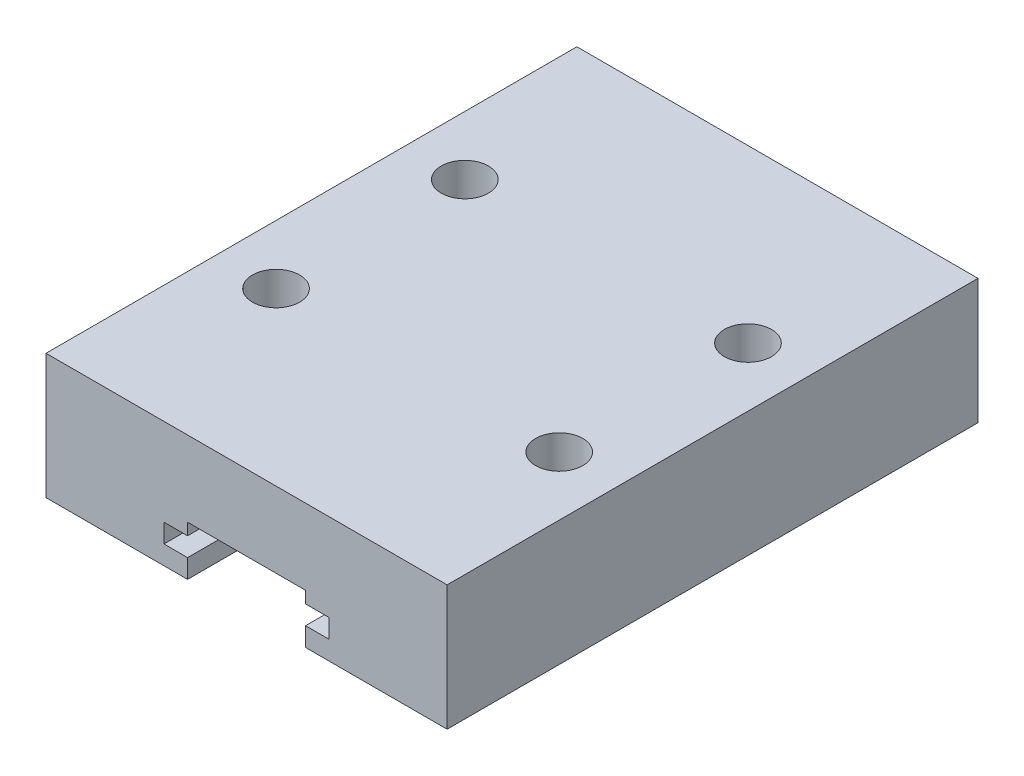
ISO-10303-21;
HEADER;
FILE_DESCRIPTION(('STEP AP214'),'2;1');
FILE_NAME('part.step','',(''),(''),'','','');
FILE_SCHEMA(('AUTOMOTIVE_DESIGN { 1 0 10303 214 1 1 1 1 }'));
ENDSEC;
DATA;
#1=APPLICATION_CONTEXT('core data for automotive mechanical design processes');
#2=APPLICATION_PROTOCOL_DEFINITION('international standard','automotive_design',2000,#1);
#3=PRODUCT_CONTEXT('',#1,'mechanical');
#4=PRODUCT('Part','Part','',(#3));
#5=PRODUCT_RELATED_PRODUCT_CATEGORY('part','',(#4));
#6=PRODUCT_DEFINITION_FORMATION('','',#4);
#7=PRODUCT_DEFINITION_CONTEXT('part definition',#1,'design');
#8=PRODUCT_DEFINITION('design','',#6,#7);
#9=PRODUCT_DEFINITION_SHAPE('','',#8);
#10=(LENGTH_UNIT() NAMED_UNIT(*) SI_UNIT(.MILLI.,.METRE.));
#11=(NAMED_UNIT(*) PLANE_ANGLE_UNIT() SI_UNIT($,.RADIAN.));
#12=(NAMED_UNIT(*) SI_UNIT($,.STERADIAN.) SOLID_ANGLE_UNIT());
#13=UNCERTAINTY_MEASURE_WITH_UNIT(LENGTH_MEASURE(1.E-05),#10,'distance_accuracy_value','');
#14=(GEOMETRIC_REPRESENTATION_CONTEXT(3) GLOBAL_UNCERTAINTY_ASSIGNED_CONTEXT((#13)) GLOBAL_UNIT_ASSIGNED_CONTEXT((#10,
#11,#12)) REPRESENTATION_CONTEXT('',''));
#15=CARTESIAN_POINT('',(0.,0.,0.));
#16=DIRECTION('',(0.,0.,1.));
#17=DIRECTION('',(1.,0.,0.));
#18=AXIS2_PLACEMENT_3D('',#15,#16,#17);
#19=CARTESIAN_POINT('',(-12.0658090822432,0.,22.5));
#20=DIRECTION('',(-1.,0.,0.));
#21=DIRECTION('',(0.,-1.,0.));
#22=AXIS2_PLACEMENT_3D('',#19,#20,#21);
#23=PLANE('',#22);
#24=DIRECTION('',(0.,1.,0.));
#25=VECTOR('',#24,1.);
#26=CARTESIAN_POINT('',(-12.0658090822432,0.,0.));
#27=LINE('',#26,#25);
#28=CARTESIAN_POINT('',(-12.0658090822431,-8.88088444953767,0.));
#29=VERTEX_POINT('',#28);
#30=CARTESIAN_POINT('',(-12.0658090822431,-8.38088444953767,0.));
#31=VERTEX_POINT('',#30);
#32=EDGE_CURVE('E184',#29,#31,#27,.T.);
#33=ORIENTED_EDGE('',*,*,#32,.T.);
#34=DIRECTION('',(0.,0.,-1.));
#35=VECTOR('',#34,1.);
#36=CARTESIAN_POINT('',(-12.0658090822431,-8.38088444953767,22.5));
#37=LINE('',#36,#35);
#38=CARTESIAN_POINT('',(-12.0658090822431,-8.38088444953767,22.5));
#39=VERTEX_POINT('',#38);
#40=EDGE_CURVE('E11',#39,#31,#37,.T.);
#41=ORIENTED_EDGE('',*,*,#40,.F.);
#42=DIRECTION('',(0.,1.,0.));
#43=VECTOR('',#42,1.);
#44=CARTESIAN_POINT('',(-12.0658090822432,0.,22.5));
#45=LINE('',#44,#43);
#46=CARTESIAN_POINT('',(-12.0658090822431,-8.88088444953767,22.5));
#47=VERTEX_POINT('',#46);
#48=EDGE_CURVE('E221',#47,#39,#45,.T.);
#49=ORIENTED_EDGE('',*,*,#48,.F.);
#50=DIRECTION('',(0.,0.,-1.));
#51=VECTOR('',#50,1.);
#52=CARTESIAN_POINT('',(-12.0658090822431,-8.88088444953767,22.5));
#53=LINE('',#52,#51);
#54=EDGE_CURVE('E56',#47,#29,#53,.T.);
#55=ORIENTED_EDGE('',*,*,#54,.T.);
#56=EDGE_LOOP('',(#33,#41,#49,#55));
#57=FACE_BOUND('',#56,.T.);
#58=ADVANCED_FACE('F39',(#57),#23,.F.);
#59=CARTESIAN_POINT('',(0.,-8.38088444953766,22.5));
#60=DIRECTION('',(0.,1.,0.));
#61=DIRECTION('',(-1.,0.,0.));
#62=AXIS2_PLACEMENT_3D('',#59,#60,#61);
#63=PLANE('',#62);
#64=DIRECTION('',(1.,0.,0.));
#65=VECTOR('',#64,1.);
#66=CARTESIAN_POINT('',(0.,-8.38088444953766,0.));
#67=LINE('',#66,#65);
#68=CARTESIAN_POINT('',(-7.06580908224315,-8.38088444953766,0.));
#69=VERTEX_POINT('',#68);
#70=EDGE_CURVE('E186',#31,#69,#67,.T.);
#71=ORIENTED_EDGE('',*,*,#70,.T.);
#72=DIRECTION('',(0.,0.,-1.));
#73=VECTOR('',#72,1.);
#74=CARTESIAN_POINT('',(-7.06580908224315,-8.38088444953766,22.5));
#75=LINE('',#74,#73);
#76=CARTESIAN_POINT('',(-7.06580908224315,-8.38088444953766,22.5));
#77=VERTEX_POINT('',#76);
#78=EDGE_CURVE('E48',#77,#69,#75,.T.);
#79=ORIENTED_EDGE('',*,*,#78,.F.);
#80=DIRECTION('',(1.,0.,0.));
#81=VECTOR('',#80,1.);
#82=CARTESIAN_POINT('',(0.,-8.38088444953766,22.5));
#83=LINE('',#82,#81);
#84=EDGE_CURVE('E118',#39,#77,#83,.T.);
#85=ORIENTED_EDGE('',*,*,#84,.F.);
#86=ORIENTED_EDGE('',*,*,#40,.T.);
#87=EDGE_LOOP('',(#71,#79,#85,#86));
#88=FACE_BOUND('',#87,.T.);
#89=ADVANCED_FACE('F41',(#88),#63,.F.);
#90=CARTESIAN_POINT('',(-7.06580908224315,0.,22.5));
#91=DIRECTION('',(-1.,0.,0.));
#92=DIRECTION('',(0.,-1.,0.));
#93=AXIS2_PLACEMENT_3D('',#90,#91,#92);
#94=PLANE('',#93);
#95=DIRECTION('',(0.,1.,0.));
#96=VECTOR('',#95,1.);
#97=CARTESIAN_POINT('',(-7.06580908224315,0.,0.));
#98=LINE('',#97,#96);
#99=CARTESIAN_POINT('',(-7.06580908224315,-8.88088444953766,0.));
#100=VERTEX_POINT('',#99);
#101=EDGE_CURVE('E191',#100,#69,#98,.T.);
#102=ORIENTED_EDGE('',*,*,#101,.F.);
#103=DIRECTION('',(0.,0.,-1.));
#104=VECTOR('',#103,1.);
#105=CARTESIAN_POINT('',(-7.06580908224315,-8.88088444953766,22.5));
#106=LINE('',#105,#104);
#107=CARTESIAN_POINT('',(-7.06580908224315,-8.88088444953766,22.5));
#108=VERTEX_POINT('',#107);
#109=EDGE_CURVE('E247',#108,#100,#106,.T.);
#110=ORIENTED_EDGE('',*,*,#109,.F.);
#111=DIRECTION('',(0.,1.,0.));
#112=VECTOR('',#111,1.);
#113=CARTESIAN_POINT('',(-7.06580908224315,0.,22.5));
#114=LINE('',#113,#112);
#115=EDGE_CURVE('E253',#108,#77,#114,.T.);
#116=ORIENTED_EDGE('',*,*,#115,.T.);
#117=ORIENTED_EDGE('',*,*,#78,.T.);
#118=EDGE_LOOP('',(#102,#110,#116,#117));
#119=FACE_BOUND('',#118,.T.);
#120=ADVANCED_FACE('F251',(#119),#94,.T.);
#121=CARTESIAN_POINT('',(0.,-8.88088444953766,22.5));
#122=DIRECTION('',(0.,1.,0.));
#123=DIRECTION('',(0.,0.,1.));
#124=AXIS2_PLACEMENT_3D('',#121,#122,#123);
#125=PLANE('',#124);
#126=DIRECTION('',(1.,0.,0.));
#127=VECTOR('',#126,1.);
#128=CARTESIAN_POINT('',(0.,-8.88088444953766,0.));
#129=LINE('',#128,#127);
#130=CARTESIAN_POINT('',(-6.06580908224315,-8.88088444953766,0.));
#131=VERTEX_POINT('',#130);
#132=EDGE_CURVE('E194',#100,#131,#129,.T.);
#133=ORIENTED_EDGE('',*,*,#132,.T.);
#134=DIRECTION('',(0.,0.,-1.));
#135=VECTOR('',#134,1.);
#136=CARTESIAN_POINT('',(-6.06580908224315,-8.88088444953766,22.5));
#137=LINE('',#136,#135);
#138=CARTESIAN_POINT('',(-6.06580908224315,-8.88088444953766,22.5));
#139=VERTEX_POINT('',#138);
#140=EDGE_CURVE('E244',#139,#131,#137,.T.);
#141=ORIENTED_EDGE('',*,*,#140,.F.);
#142=DIRECTION('',(1.,0.,0.));
#143=VECTOR('',#142,1.);
#144=CARTESIAN_POINT('',(0.,-8.88088444953766,22.5));
#145=LINE('',#144,#143);
#146=EDGE_CURVE('E271',#108,#139,#145,.T.);
#147=ORIENTED_EDGE('',*,*,#146,.F.);
#148=ORIENTED_EDGE('',*,*,#109,.T.);
#149=EDGE_LOOP('',(#133,#141,#147,#148));
#150=FACE_BOUND('',#149,.T.);
#151=ADVANCED_FACE('F262',(#150),#125,.F.);
#152=CARTESIAN_POINT('',(-6.06580908224316,0.,22.5));
#153=DIRECTION('',(1.,0.,0.));
#154=DIRECTION('',(0.,1.,0.));
#155=AXIS2_PLACEMENT_3D('',#152,#153,#154);
#156=PLANE('',#155);
#157=DIRECTION('',(0.,-1.,0.));
#158=VECTOR('',#157,1.);
#159=CARTESIAN_POINT('',(-6.06580908224316,0.,0.));
#160=LINE('',#159,#158);
#161=CARTESIAN_POINT('',(-6.06580908224315,-9.68088444953766,0.));
#162=VERTEX_POINT('',#161);
#163=EDGE_CURVE('E197',#131,#162,#160,.T.);
#164=ORIENTED_EDGE('',*,*,#163,.T.);
#165=DIRECTION('',(0.,0.,-1.));
#166=VECTOR('',#165,1.);
#167=CARTESIAN_POINT('',(-6.06580908224315,-9.68088444953766,22.5));
#168=LINE('',#167,#166);
#169=CARTESIAN_POINT('',(-6.06580908224315,-9.68088444953766,22.5));
#170=VERTEX_POINT('',#169);
#171=EDGE_CURVE('E241',#170,#162,#168,.T.);
#172=ORIENTED_EDGE('',*,*,#171,.F.);
#173=DIRECTION('',(0.,-1.,0.));
#174=VECTOR('',#173,1.);
#175=CARTESIAN_POINT('',(-6.06580908224316,0.,22.5));
#176=LINE('',#175,#174);
#177=EDGE_CURVE('E268',#139,#170,#176,.T.);
#178=ORIENTED_EDGE('',*,*,#177,.F.);
#179=ORIENTED_EDGE('',*,*,#140,.T.);
#180=EDGE_LOOP('',(#164,#172,#178,#179));
#181=FACE_BOUND('',#180,.T.);
#182=ADVANCED_FACE('F266',(#181),#156,.F.);
#183=CARTESIAN_POINT('',(0.,-9.68088444953766,22.5));
#184=DIRECTION('',(0.,-1.,0.));
#185=DIRECTION('',(0.,0.,-1.));
#186=AXIS2_PLACEMENT_3D('',#183,#184,#185);
#187=PLANE('',#186);
#188=DIRECTION('',(-1.,0.,0.));
#189=VECTOR('',#188,1.);
#190=CARTESIAN_POINT('',(0.,-9.68088444953766,0.));
#191=LINE('',#190,#189);
#192=CARTESIAN_POINT('',(-7.06580908224315,-9.68088444953766,0.));
#193=VERTEX_POINT('',#192);
#194=EDGE_CURVE('E199',#162,#193,#191,.T.);
#195=ORIENTED_EDGE('',*,*,#194,.T.);
#196=DIRECTION('',(0.,0.,-1.));
#197=VECTOR('',#196,1.);
#198=CARTESIAN_POINT('',(-7.06580908224315,-9.68088444953766,22.5));
#199=LINE('',#198,#197);
#200=CARTESIAN_POINT('',(-7.06580908224315,-9.68088444953766,22.5));
#201=VERTEX_POINT('',#200);
#202=EDGE_CURVE('E239',#201,#193,#199,.T.);
#203=ORIENTED_EDGE('',*,*,#202,.F.);
#204=DIRECTION('',(-1.,0.,0.));
#205=VECTOR('',#204,1.);
#206=CARTESIAN_POINT('',(0.,-9.68088444953766,22.5));
#207=LINE('',#206,#205);
#208=EDGE_CURVE('E270',#170,#201,#207,.T.);
#209=ORIENTED_EDGE('',*,*,#208,.F.);
#210=ORIENTED_EDGE('',*,*,#171,.T.);
#211=EDGE_LOOP('',(#195,#203,#209,#210));
#212=FACE_BOUND('',#211,.T.);
#213=ADVANCED_FACE('F303',(#212),#187,.F.);
#214=CARTESIAN_POINT('',(-7.06580908224315,-10.4808844495377,0.));
#215=VERTEX_POINT('',#214);
#216=EDGE_CURVE('E195',#215,#193,#98,.T.);
#217=ORIENTED_EDGE('',*,*,#216,.F.);
#218=DIRECTION('',(0.,0.,-1.));
#219=VECTOR('',#218,1.);
#220=CARTESIAN_POINT('',(-7.06580908224315,-10.4808844495377,22.5));
#221=LINE('',#220,#219);
#222=CARTESIAN_POINT('',(-7.06580908224315,-10.4808844495377,22.5));
#223=VERTEX_POINT('',#222);
#224=EDGE_CURVE('E237',#223,#215,#221,.T.);
#225=ORIENTED_EDGE('',*,*,#224,.F.);
#226=EDGE_CURVE('E273',#223,#201,#114,.T.);
#227=ORIENTED_EDGE('',*,*,#226,.T.);
#228=ORIENTED_EDGE('',*,*,#202,.T.);
#229=EDGE_LOOP('',(#217,#225,#227,#228));
#230=FACE_BOUND('',#229,.T.);
#231=ADVANCED_FACE('F297',(#230),#94,.T.);
#232=CARTESIAN_POINT('',(0.,-10.4808844495377,22.5));
#233=DIRECTION('',(0.,1.,0.));
#234=DIRECTION('',(0.,0.,1.));
#235=AXIS2_PLACEMENT_3D('',#232,#233,#234);
#236=PLANE('',#235);
#237=DIRECTION('',(1.,0.,0.));
#238=VECTOR('',#237,1.);
#239=CARTESIAN_POINT('',(0.,-10.4808844495377,0.));
#240=LINE('',#239,#238);
#241=CARTESIAN_POINT('',(-1.06580908224315,-10.4808844495377,0.));
#242=VERTEX_POINT('',#241);
#243=EDGE_CURVE('E202',#215,#242,#240,.T.);
#244=ORIENTED_EDGE('',*,*,#243,.T.);
#245=DIRECTION('',(0.,0.,-1.));
#246=VECTOR('',#245,1.);
#247=CARTESIAN_POINT('',(-1.06580908224315,-10.4808844495377,22.5));
#248=LINE('',#247,#246);
#249=CARTESIAN_POINT('',(-1.06580908224315,-10.4808844495377,22.5));
#250=VERTEX_POINT('',#249);
#251=EDGE_CURVE('E235',#250,#242,#248,.T.);
#252=ORIENTED_EDGE('',*,*,#251,.F.);
#253=DIRECTION('',(1.,0.,0.));
#254=VECTOR('',#253,1.);
#255=CARTESIAN_POINT('',(0.,-10.4808844495377,22.5));
#256=LINE('',#255,#254);
#257=EDGE_CURVE('E278',#223,#250,#256,.T.);
#258=ORIENTED_EDGE('',*,*,#257,.F.);
#259=ORIENTED_EDGE('',*,*,#224,.T.);
#260=EDGE_LOOP('',(#244,#252,#258,#259));
#261=FACE_BOUND('',#260,.T.);
#262=ADVANCED_FACE('F308',(#261),#236,.F.);
#263=CARTESIAN_POINT('',(-1.06580908224315,0.,22.5));
#264=DIRECTION('',(1.,0.,0.));
#265=DIRECTION('',(0.,1.,0.));
#266=AXIS2_PLACEMENT_3D('',#263,#264,#265);
#267=PLANE('',#266);
#268=DIRECTION('',(0.,-1.,0.));
#269=VECTOR('',#268,1.);
#270=CARTESIAN_POINT('',(-1.06580908224315,0.,0.));
#271=LINE('',#270,#269);
#272=CARTESIAN_POINT('',(-1.06580908224315,-5.18088444953767,0.));
#273=VERTEX_POINT('',#272);
#274=EDGE_CURVE('E205',#273,#242,#271,.T.);
#275=ORIENTED_EDGE('',*,*,#274,.F.);
#276=DIRECTION('',(0.,0.,-1.));
#277=VECTOR('',#276,1.);
#278=CARTESIAN_POINT('',(-1.06580908224315,-5.18088444953767,22.5));
#279=LINE('',#278,#277);
#280=CARTESIAN_POINT('',(-1.06580908224315,-5.18088444953767,22.5));
#281=VERTEX_POINT('',#280);
#282=EDGE_CURVE('E233',#281,#273,#279,.T.);
#283=ORIENTED_EDGE('',*,*,#282,.F.);
#284=DIRECTION('',(0.,-1.,0.));
#285=VECTOR('',#284,1.);
#286=CARTESIAN_POINT('',(-1.06580908224315,0.,22.5));
#287=LINE('',#286,#285);
#288=EDGE_CURVE('E280',#281,#250,#287,.T.);
#289=ORIENTED_EDGE('',*,*,#288,.T.);
#290=ORIENTED_EDGE('',*,*,#251,.T.);
#291=EDGE_LOOP('',(#275,#283,#289,#290));
#292=FACE_BOUND('',#291,.T.);
#293=ADVANCED_FACE('F310',(#292),#267,.T.);
#294=CARTESIAN_POINT('',(0.,-5.18088444953767,22.5));
#295=DIRECTION('',(0.,1.,0.));
#296=DIRECTION('',(0.,0.,1.));
#297=AXIS2_PLACEMENT_3D('',#294,#295,#296);
#298=PLANE('',#297);
#299=CARTESIAN_POINT('',(-15.5658090822431,-5.18088444953767,15.25));
#300=DIRECTION('',(0.,1.,0.));
#301=DIRECTION('',(0.,0.,1.));
#302=AXIS2_PLACEMENT_3D('',#299,#300,#301);
#303=CIRCLE('',#302,1.);
#304=CARTESIAN_POINT('',(-15.5658090822431,-5.18088444953767,16.25));
#305=VERTEX_POINT('',#304);
#306=EDGE_CURVE('E616',#305,#305,#303,.T.);
#307=ORIENTED_EDGE('',*,*,#306,.F.);
#308=EDGE_LOOP('',(#307));
#309=FACE_BOUND('',#308,.T.);
#310=CARTESIAN_POINT('',(-3.56580908224315,-5.18088444953767,7.25));
#311=DIRECTION('',(0.,1.,0.));
#312=DIRECTION('',(0.,0.,1.));
#313=AXIS2_PLACEMENT_3D('',#310,#311,#312);
#314=CIRCLE('',#313,1.);
#315=CARTESIAN_POINT('',(-3.56580908224315,-5.18088444953767,8.25));
#316=VERTEX_POINT('',#315);
#317=EDGE_CURVE('E617',#316,#316,#314,.T.);
#318=ORIENTED_EDGE('',*,*,#317,.F.);
#319=EDGE_LOOP('',(#318));
#320=FACE_BOUND('',#319,.T.);
#321=CARTESIAN_POINT('',(-3.56580908224315,-5.18088444953767,15.25));
#322=DIRECTION('',(0.,1.,0.));
#323=DIRECTION('',(0.,0.,1.));
#324=AXIS2_PLACEMENT_3D('',#321,#322,#323);
#325=CIRCLE('',#324,1.);
#326=CARTESIAN_POINT('',(-3.56580908224315,-5.18088444953767,16.25));
#327=VERTEX_POINT('',#326);
#328=EDGE_CURVE('E629',#327,#327,#325,.T.);
#329=ORIENTED_EDGE('',*,*,#328,.F.);
#330=EDGE_LOOP('',(#329));
#331=FACE_BOUND('',#330,.T.);
#332=CARTESIAN_POINT('',(-15.5658090822431,-5.18088444953767,7.25));
#333=DIRECTION('',(0.,1.,0.));
#334=DIRECTION('',(0.,0.,1.));
#335=AXIS2_PLACEMENT_3D('',#332,#333,#334);
#336=CIRCLE('',#335,1.);
#337=CARTESIAN_POINT('',(-15.5658090822431,-5.18088444953767,8.25));
#338=VERTEX_POINT('',#337);
#339=EDGE_CURVE('E620',#338,#338,#336,.T.);
#340=ORIENTED_EDGE('',*,*,#339,.F.);
#341=EDGE_LOOP('',(#340));
#342=FACE_BOUND('',#341,.T.);
#343=DIRECTION('',(1.,0.,0.));
#344=VECTOR('',#343,1.);
#345=CARTESIAN_POINT('',(0.,-5.18088444953767,0.));
#346=LINE('',#345,#344);
#347=CARTESIAN_POINT('',(-18.0658090822431,-5.18088444953767,0.));
#348=VERTEX_POINT('',#347);
#349=EDGE_CURVE('E208',#348,#273,#346,.T.);
#350=ORIENTED_EDGE('',*,*,#349,.F.);
#351=DIRECTION('',(0.,0.,-1.));
#352=VECTOR('',#351,1.);
#353=CARTESIAN_POINT('',(-18.0658090822431,-5.18088444953767,22.5));
#354=LINE('',#353,#352);
#355=CARTESIAN_POINT('',(-18.0658090822431,-5.18088444953767,22.5));
#356=VERTEX_POINT('',#355);
#357=EDGE_CURVE('E231',#356,#348,#354,.T.);
#358=ORIENTED_EDGE('',*,*,#357,.F.);
#359=DIRECTION('',(1.,0.,0.));
#360=VECTOR('',#359,1.);
#361=CARTESIAN_POINT('',(0.,-5.18088444953767,22.5));
#362=LINE('',#361,#360);
#363=EDGE_CURVE('E283',#356,#281,#362,.T.);
#364=ORIENTED_EDGE('',*,*,#363,.T.);
#365=ORIENTED_EDGE('',*,*,#282,.T.);
#366=EDGE_LOOP('',(#350,#358,#364,#365));
#367=FACE_BOUND('',#366,.T.);
#368=ADVANCED_FACE('F314',(#309,#320,#331,#342,#367),#298,.T.);
#369=CARTESIAN_POINT('',(-18.0658090822431,0.,22.5));
#370=DIRECTION('',(1.,0.,0.));
#371=DIRECTION('',(0.,1.,0.));
#372=AXIS2_PLACEMENT_3D('',#369,#370,#371);
#373=PLANE('',#372);
#374=DIRECTION('',(0.,-1.,0.));
#375=VECTOR('',#374,1.);
#376=CARTESIAN_POINT('',(-18.0658090822431,0.,0.));
#377=LINE('',#376,#375);
#378=CARTESIAN_POINT('',(-18.0658090822432,-10.4808844495377,0.));
#379=VERTEX_POINT('',#378);
#380=EDGE_CURVE('E211',#348,#379,#377,.T.);
#381=ORIENTED_EDGE('',*,*,#380,.T.);
#382=DIRECTION('',(0.,0.,-1.));
#383=VECTOR('',#382,1.);
#384=CARTESIAN_POINT('',(-18.0658090822432,-10.4808844495377,22.5));
#385=LINE('',#384,#383);
#386=CARTESIAN_POINT('',(-18.0658090822432,-10.4808844495377,22.5));
#387=VERTEX_POINT('',#386);
#388=EDGE_CURVE('E228',#387,#379,#385,.T.);
#389=ORIENTED_EDGE('',*,*,#388,.F.);
#390=DIRECTION('',(0.,-1.,0.));
#391=VECTOR('',#390,1.);
#392=CARTESIAN_POINT('',(-18.0658090822431,0.,22.5));
#393=LINE('',#392,#391);
#394=EDGE_CURVE('E286',#356,#387,#393,.T.);
#395=ORIENTED_EDGE('',*,*,#394,.F.);
#396=ORIENTED_EDGE('',*,*,#357,.T.);
#397=EDGE_LOOP('',(#381,#389,#395,#396));
#398=FACE_BOUND('',#397,.T.);
#399=ADVANCED_FACE('F319',(#398),#373,.F.);
#400=CARTESIAN_POINT('',(0.,-10.4808844495377,22.5));
#401=DIRECTION('',(0.,1.,0.));
#402=DIRECTION('',(0.,0.,1.));
#403=AXIS2_PLACEMENT_3D('',#400,#401,#402);
#404=PLANE('',#403);
#405=DIRECTION('',(1.,0.,0.));
#406=VECTOR('',#405,1.);
#407=CARTESIAN_POINT('',(0.,-10.4808844495377,0.));
#408=LINE('',#407,#406);
#409=CARTESIAN_POINT('',(-12.0658090822431,-10.4808844495377,0.));
#410=VERTEX_POINT('',#409);
#411=EDGE_CURVE('E213',#379,#410,#408,.T.);
#412=ORIENTED_EDGE('',*,*,#411,.T.);
#413=DIRECTION('',(0.,0.,-1.));
#414=VECTOR('',#413,1.);
#415=CARTESIAN_POINT('',(-12.0658090822431,-10.4808844495377,22.5));
#416=LINE('',#415,#414);
#417=CARTESIAN_POINT('',(-12.0658090822431,-10.4808844495377,22.5));
#418=VERTEX_POINT('',#417);
#419=EDGE_CURVE('E225',#418,#410,#416,.T.);
#420=ORIENTED_EDGE('',*,*,#419,.F.);
#421=DIRECTION('',(1.,0.,0.));
#422=VECTOR('',#421,1.);
#423=CARTESIAN_POINT('',(0.,-10.4808844495377,22.5));
#424=LINE('',#423,#422);
#425=EDGE_CURVE('E287',#387,#418,#424,.T.);
#426=ORIENTED_EDGE('',*,*,#425,.F.);
#427=ORIENTED_EDGE('',*,*,#388,.T.);
#428=EDGE_LOOP('',(#412,#420,#426,#427));
#429=FACE_BOUND('',#428,.T.);
#430=ADVANCED_FACE('F322',(#429),#404,.F.);
#431=CARTESIAN_POINT('',(-12.0658090822431,-9.68088444953767,0.));
#432=VERTEX_POINT('',#431);
#433=EDGE_CURVE('E188',#410,#432,#27,.T.);
#434=ORIENTED_EDGE('',*,*,#433,.T.);
#435=DIRECTION('',(0.,0.,-1.));
#436=VECTOR('',#435,1.);
#437=CARTESIAN_POINT('',(-12.0658090822431,-9.68088444953767,22.5));
#438=LINE('',#437,#436);
#439=CARTESIAN_POINT('',(-12.0658090822431,-9.68088444953767,22.5));
#440=VERTEX_POINT('',#439);
#441=EDGE_CURVE('E167',#440,#432,#438,.T.);
#442=ORIENTED_EDGE('',*,*,#441,.F.);
#443=EDGE_CURVE('E175',#418,#440,#45,.T.);
#444=ORIENTED_EDGE('',*,*,#443,.F.);
#445=ORIENTED_EDGE('',*,*,#419,.T.);
#446=EDGE_LOOP('',(#434,#442,#444,#445));
#447=FACE_BOUND('',#446,.T.);
#448=ADVANCED_FACE('F326',(#447),#23,.F.);
#449=CARTESIAN_POINT('',(0.,-9.68088444953767,22.5));
#450=DIRECTION('',(0.,1.,0.));
#451=DIRECTION('',(0.,0.,1.));
#452=AXIS2_PLACEMENT_3D('',#449,#450,#451);
#453=PLANE('',#452);
#454=DIRECTION('',(1.,0.,0.));
#455=VECTOR('',#454,1.);
#456=CARTESIAN_POINT('',(0.,-9.68088444953767,0.));
#457=LINE('',#456,#455);
#458=CARTESIAN_POINT('',(-13.0658090822431,-9.68088444953767,0.));
#459=VERTEX_POINT('',#458);
#460=EDGE_CURVE('E163',#459,#432,#457,.T.);
#461=ORIENTED_EDGE('',*,*,#460,.F.);
#462=DIRECTION('',(0.,0.,-1.));
#463=VECTOR('',#462,1.);
#464=CARTESIAN_POINT('',(-13.0658090822431,-9.68088444953767,22.5));
#465=LINE('',#464,#463);
#466=CARTESIAN_POINT('',(-13.0658090822431,-9.68088444953767,22.5));
#467=VERTEX_POINT('',#466);
#468=EDGE_CURVE('E158',#467,#459,#465,.T.);
#469=ORIENTED_EDGE('',*,*,#468,.F.);
#470=DIRECTION('',(1.,0.,0.));
#471=VECTOR('',#470,1.);
#472=CARTESIAN_POINT('',(0.,-9.68088444953767,22.5));
#473=LINE('',#472,#471);
#474=EDGE_CURVE('E161',#467,#440,#473,.T.);
#475=ORIENTED_EDGE('',*,*,#474,.T.);
#476=ORIENTED_EDGE('',*,*,#441,.T.);
#477=EDGE_LOOP('',(#461,#469,#475,#476));
#478=FACE_BOUND('',#477,.T.);
#479=ADVANCED_FACE('F160',(#478),#453,.T.);
#480=CARTESIAN_POINT('',(-13.0658090822431,0.,22.5));
#481=DIRECTION('',(1.,0.,0.));
#482=DIRECTION('',(0.,0.,-1.));
#483=AXIS2_PLACEMENT_3D('',#480,#481,#482);
#484=PLANE('',#483);
#485=DIRECTION('',(0.,-1.,0.));
#486=VECTOR('',#485,1.);
#487=CARTESIAN_POINT('',(-13.0658090822431,0.,0.));
#488=LINE('',#487,#486);
#489=CARTESIAN_POINT('',(-13.0658090822431,-8.88088444953767,0.));
#490=VERTEX_POINT('',#489);
#491=EDGE_CURVE('E216',#490,#459,#488,.T.);
#492=ORIENTED_EDGE('',*,*,#491,.F.);
#493=DIRECTION('',(0.,0.,-1.));
#494=VECTOR('',#493,1.);
#495=CARTESIAN_POINT('',(-13.0658090822431,-8.88088444953767,22.5));
#496=LINE('',#495,#494);
#497=CARTESIAN_POINT('',(-13.0658090822431,-8.88088444953767,22.5));
#498=VERTEX_POINT('',#497);
#499=EDGE_CURVE('E106',#498,#490,#496,.T.);
#500=ORIENTED_EDGE('',*,*,#499,.F.);
#501=DIRECTION('',(0.,-1.,0.));
#502=VECTOR('',#501,1.);
#503=CARTESIAN_POINT('',(-13.0658090822431,0.,22.5));
#504=LINE('',#503,#502);
#505=EDGE_CURVE('E173',#498,#467,#504,.T.);
#506=ORIENTED_EDGE('',*,*,#505,.T.);
#507=ORIENTED_EDGE('',*,*,#468,.T.);
#508=EDGE_LOOP('',(#492,#500,#506,#507));
#509=FACE_BOUND('',#508,.T.);
#510=ADVANCED_FACE('F178',(#509),#484,.T.);
#511=CARTESIAN_POINT('',(0.,-8.88088444953767,22.5));
#512=DIRECTION('',(0.,-1.,0.));
#513=DIRECTION('',(0.,0.,-1.));
#514=AXIS2_PLACEMENT_3D('',#511,#512,#513);
#515=PLANE('',#514);
#516=DIRECTION('',(-1.,0.,0.));
#517=VECTOR('',#516,1.);
#518=CARTESIAN_POINT('',(0.,-8.88088444953767,0.));
#519=LINE('',#518,#517);
#520=EDGE_CURVE('E218',#29,#490,#519,.T.);
#521=ORIENTED_EDGE('',*,*,#520,.F.);
#522=ORIENTED_EDGE('',*,*,#54,.F.);
#523=DIRECTION('',(-1.,0.,0.));
#524=VECTOR('',#523,1.);
#525=CARTESIAN_POINT('',(0.,-8.88088444953767,22.5));
#526=LINE('',#525,#524);
#527=EDGE_CURVE('E179',#47,#498,#526,.T.);
#528=ORIENTED_EDGE('',*,*,#527,.T.);
#529=ORIENTED_EDGE('',*,*,#499,.T.);
#530=EDGE_LOOP('',(#521,#522,#528,#529));
#531=FACE_BOUND('',#530,.T.);
#532=ADVANCED_FACE('F327',(#531),#515,.T.);
#533=CARTESIAN_POINT('',(0.,0.,22.5));
#534=DIRECTION('',(0.,0.,1.));
#535=DIRECTION('',(1.,0.,0.));
#536=AXIS2_PLACEMENT_3D('',#533,#534,#535);
#537=PLANE('',#536);
#538=ORIENTED_EDGE('',*,*,#48,.T.);
#539=ORIENTED_EDGE('',*,*,#84,.T.);
#540=ORIENTED_EDGE('',*,*,#115,.F.);
#541=ORIENTED_EDGE('',*,*,#146,.T.);
#542=ORIENTED_EDGE('',*,*,#177,.T.);
#543=ORIENTED_EDGE('',*,*,#208,.T.);
#544=ORIENTED_EDGE('',*,*,#226,.F.);
#545=ORIENTED_EDGE('',*,*,#257,.T.);
#546=ORIENTED_EDGE('',*,*,#288,.F.);
#547=ORIENTED_EDGE('',*,*,#363,.F.);
#548=ORIENTED_EDGE('',*,*,#394,.T.);
#549=ORIENTED_EDGE('',*,*,#425,.T.);
#550=ORIENTED_EDGE('',*,*,#443,.T.);
#551=ORIENTED_EDGE('',*,*,#474,.F.);
#552=ORIENTED_EDGE('',*,*,#505,.F.);
#553=ORIENTED_EDGE('',*,*,#527,.F.);
#554=EDGE_LOOP('',(#538,#539,#540,#541,#542,#543,#544,#545,#546,#547,#548,#549,#550,#551,#552,#553));
#555=FACE_BOUND('',#554,.T.);
#556=ADVANCED_FACE('F171',(#555),#537,.T.);
#557=CARTESIAN_POINT('',(0.,0.,0.));
#558=DIRECTION('',(0.,0.,1.));
#559=DIRECTION('',(1.,0.,0.));
#560=AXIS2_PLACEMENT_3D('',#557,#558,#559);
#561=PLANE('',#560);
#562=ORIENTED_EDGE('',*,*,#32,.F.);
#563=ORIENTED_EDGE('',*,*,#520,.T.);
#564=ORIENTED_EDGE('',*,*,#491,.T.);
#565=ORIENTED_EDGE('',*,*,#460,.T.);
#566=ORIENTED_EDGE('',*,*,#433,.F.);
#567=ORIENTED_EDGE('',*,*,#411,.F.);
#568=ORIENTED_EDGE('',*,*,#380,.F.);
#569=ORIENTED_EDGE('',*,*,#349,.T.);
#570=ORIENTED_EDGE('',*,*,#274,.T.);
#571=ORIENTED_EDGE('',*,*,#243,.F.);
#572=ORIENTED_EDGE('',*,*,#216,.T.);
#573=ORIENTED_EDGE('',*,*,#194,.F.);
#574=ORIENTED_EDGE('',*,*,#163,.F.);
#575=ORIENTED_EDGE('',*,*,#132,.F.);
#576=ORIENTED_EDGE('',*,*,#101,.T.);
#577=ORIENTED_EDGE('',*,*,#70,.F.);
#578=EDGE_LOOP('',(#562,#563,#564,#565,#566,#567,#568,#569,#570,#571,#572,#573,#574,#575,#576,#577));
#579=FACE_BOUND('',#578,.T.);
#580=ADVANCED_FACE('F257',(#579),#561,.F.);
#581=CARTESIAN_POINT('',(-15.5658090822431,-7.18088444953767,7.25));
#582=DIRECTION('',(0.,1.,0.));
#583=DIRECTION('',(0.,0.,1.));
#584=AXIS2_PLACEMENT_3D('',#581,#582,#583);
#585=CYLINDRICAL_SURFACE('',#584,1.);
#586=CARTESIAN_POINT('',(-15.5658090822431,-7.18088444953767,7.25));
#587=DIRECTION('',(0.,1.,0.));
#588=DIRECTION('',(0.,0.,1.));
#589=AXIS2_PLACEMENT_3D('',#586,#587,#588);
#590=CIRCLE('',#589,1.);
#591=CARTESIAN_POINT('',(-15.5658090822431,-7.18088444953767,8.25));
#592=VERTEX_POINT('',#591);
#593=EDGE_CURVE('E187',#592,#592,#590,.T.);
#594=ORIENTED_EDGE('',*,*,#593,.F.);
#595=EDGE_LOOP('',(#594));
#596=FACE_BOUND('',#595,.T.);
#597=ORIENTED_EDGE('',*,*,#339,.T.);
#598=EDGE_LOOP('',(#597));
#599=FACE_BOUND('',#598,.T.);
#600=ADVANCED_FACE('F481',(#596,#599),#585,.F.);
#601=CARTESIAN_POINT('',(-15.5658090822431,-7.18088444953767,7.25));
#602=DIRECTION('',(0.,1.,0.));
#603=DIRECTION('',(0.,0.,1.));
#604=AXIS2_PLACEMENT_3D('',#601,#602,#603);
#605=PLANE('',#604);
#606=ORIENTED_EDGE('',*,*,#593,.T.);
#607=EDGE_LOOP('',(#606));
#608=FACE_BOUND('',#607,.T.);
#609=ADVANCED_FACE('F489',(#608),#605,.T.);
#610=CARTESIAN_POINT('',(-3.56580908224315,-7.18088444953767,15.25));
#611=DIRECTION('',(0.,1.,0.));
#612=DIRECTION('',(0.,0.,1.));
#613=AXIS2_PLACEMENT_3D('',#610,#611,#612);
#614=CYLINDRICAL_SURFACE('',#613,1.);
#615=CARTESIAN_POINT('',(-3.56580908224315,-7.18088444953767,15.25));
#616=DIRECTION('',(0.,1.,0.));
#617=DIRECTION('',(0.,0.,1.));
#618=AXIS2_PLACEMENT_3D('',#615,#616,#617);
#619=CIRCLE('',#618,1.);
#620=CARTESIAN_POINT('',(-3.56580908224315,-7.18088444953767,16.25));
#621=VERTEX_POINT('',#620);
#622=EDGE_CURVE('E638',#621,#621,#619,.T.);
#623=ORIENTED_EDGE('',*,*,#622,.F.);
#624=EDGE_LOOP('',(#623));
#625=FACE_BOUND('',#624,.T.);
#626=ORIENTED_EDGE('',*,*,#328,.T.);
#627=EDGE_LOOP('',(#626));
#628=FACE_BOUND('',#627,.T.);
#629=ADVANCED_FACE('F499',(#625,#628),#614,.F.);
#630=CARTESIAN_POINT('',(-3.56580908224315,-7.18088444953767,15.25));
#631=DIRECTION('',(0.,1.,0.));
#632=DIRECTION('',(0.,0.,1.));
#633=AXIS2_PLACEMENT_3D('',#630,#631,#632);
#634=PLANE('',#633);
#635=ORIENTED_EDGE('',*,*,#622,.T.);
#636=EDGE_LOOP('',(#635));
#637=FACE_BOUND('',#636,.T.);
#638=ADVANCED_FACE('F509',(#637),#634,.T.);
#639=CARTESIAN_POINT('',(-3.56580908224315,-7.18088444953767,7.25));
#640=DIRECTION('',(0.,1.,0.));
#641=DIRECTION('',(0.,0.,1.));
#642=AXIS2_PLACEMENT_3D('',#639,#640,#641);
#643=CYLINDRICAL_SURFACE('',#642,1.);
#644=CARTESIAN_POINT('',(-3.56580908224315,-7.18088444953767,7.25));
#645=DIRECTION('',(0.,1.,0.));
#646=DIRECTION('',(0.,0.,1.));
#647=AXIS2_PLACEMENT_3D('',#644,#645,#646);
#648=CIRCLE('',#647,1.);
#649=CARTESIAN_POINT('',(-3.56580908224315,-7.18088444953767,8.25));
#650=VERTEX_POINT('',#649);
#651=EDGE_CURVE('E623',#650,#650,#648,.T.);
#652=ORIENTED_EDGE('',*,*,#651,.F.);
#653=EDGE_LOOP('',(#652));
#654=FACE_BOUND('',#653,.T.);
#655=ORIENTED_EDGE('',*,*,#317,.T.);
#656=EDGE_LOOP('',(#655));
#657=FACE_BOUND('',#656,.T.);
#658=ADVANCED_FACE('F519',(#654,#657),#643,.F.);
#659=CARTESIAN_POINT('',(-3.56580908224315,-7.18088444953767,7.25));
#660=DIRECTION('',(0.,1.,0.));
#661=DIRECTION('',(0.,0.,1.));
#662=AXIS2_PLACEMENT_3D('',#659,#660,#661);
#663=PLANE('',#662);
#664=ORIENTED_EDGE('',*,*,#651,.T.);
#665=EDGE_LOOP('',(#664));
#666=FACE_BOUND('',#665,.T.);
#667=ADVANCED_FACE('F529',(#666),#663,.T.);
#668=CARTESIAN_POINT('',(-15.5658090822431,-7.18088444953767,15.25));
#669=DIRECTION('',(0.,1.,0.));
#670=DIRECTION('',(0.,0.,1.));
#671=AXIS2_PLACEMENT_3D('',#668,#669,#670);
#672=CYLINDRICAL_SURFACE('',#671,1.);
#673=CARTESIAN_POINT('',(-15.5658090822431,-7.18088444953767,15.25));
#674=DIRECTION('',(0.,1.,0.));
#675=DIRECTION('',(0.,0.,1.));
#676=AXIS2_PLACEMENT_3D('',#673,#674,#675);
#677=CIRCLE('',#676,1.);
#678=CARTESIAN_POINT('',(-15.5658090822431,-7.18088444953767,16.25));
#679=VERTEX_POINT('',#678);
#680=EDGE_CURVE('E615',#679,#679,#677,.T.);
#681=ORIENTED_EDGE('',*,*,#680,.F.);
#682=EDGE_LOOP('',(#681));
#683=FACE_BOUND('',#682,.T.);
#684=ORIENTED_EDGE('',*,*,#306,.T.);
#685=EDGE_LOOP('',(#684));
#686=FACE_BOUND('',#685,.T.);
#687=ADVANCED_FACE('F539',(#683,#686),#672,.F.);
#688=CARTESIAN_POINT('',(-15.5658090822431,-7.18088444953767,15.25));
#689=DIRECTION('',(0.,1.,0.));
#690=DIRECTION('',(0.,0.,1.));
#691=AXIS2_PLACEMENT_3D('',#688,#689,#690);
#692=PLANE('',#691);
#693=ORIENTED_EDGE('',*,*,#680,.T.);
#694=EDGE_LOOP('',(#693));
#695=FACE_BOUND('',#694,.T.);
#696=ADVANCED_FACE('F549',(#695),#692,.T.);
#697=CLOSED_SHELL('',(#58,#89,#120,#151,#182,#213,#231,#262,#293,#368,#399,#430,#448,#479,#510,
#532,#556,#580,#600,#609,#629,#638,#658,#667,#687,#696));
#698=MANIFOLD_SOLID_BREP('B2',#697);
#699=ADVANCED_BREP_SHAPE_REPRESENTATION('',(#18,#698),#14);
#700=SHAPE_DEFINITION_REPRESENTATION(#9,#699);
ENDSEC;
END-ISO-10303-21;
